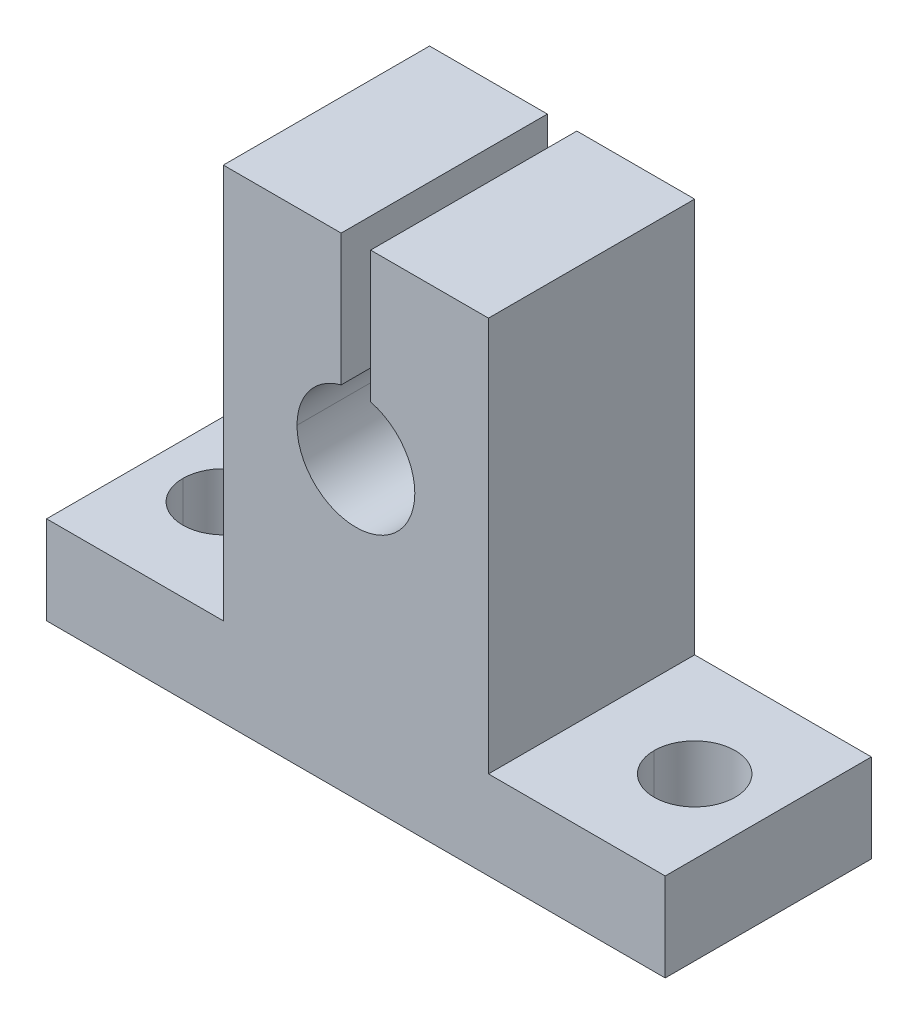
ISO-10303-21;
HEADER;
FILE_DESCRIPTION(('STEP AP214'),'2;1');
FILE_NAME('part.step','',(''),(''),'','','');
FILE_SCHEMA(('AUTOMOTIVE_DESIGN { 1 0 10303 214 1 1 1 1 }'));
ENDSEC;
DATA;
#1=APPLICATION_CONTEXT('core data for automotive mechanical design processes');
#2=APPLICATION_PROTOCOL_DEFINITION('international standard','automotive_design',2000,#1);
#3=PRODUCT_CONTEXT('',#1,'mechanical');
#4=PRODUCT('Part','Part','',(#3));
#5=PRODUCT_RELATED_PRODUCT_CATEGORY('part','',(#4));
#6=PRODUCT_DEFINITION_FORMATION('','',#4);
#7=PRODUCT_DEFINITION_CONTEXT('part definition',#1,'design');
#8=PRODUCT_DEFINITION('design','',#6,#7);
#9=PRODUCT_DEFINITION_SHAPE('','',#8);
#10=(LENGTH_UNIT() NAMED_UNIT(*) SI_UNIT(.MILLI.,.METRE.));
#11=(NAMED_UNIT(*) PLANE_ANGLE_UNIT() SI_UNIT($,.RADIAN.));
#12=(NAMED_UNIT(*) SI_UNIT($,.STERADIAN.) SOLID_ANGLE_UNIT());
#13=UNCERTAINTY_MEASURE_WITH_UNIT(LENGTH_MEASURE(1.E-05),#10,'distance_accuracy_value','');
#14=(GEOMETRIC_REPRESENTATION_CONTEXT(3) GLOBAL_UNCERTAINTY_ASSIGNED_CONTEXT((#13)) GLOBAL_UNIT_ASSIGNED_CONTEXT((#10,
#11,#12)) REPRESENTATION_CONTEXT('',''));
#15=CARTESIAN_POINT('',(0.,0.,0.));
#16=DIRECTION('',(0.,0.,1.));
#17=DIRECTION('',(1.,0.,0.));
#18=AXIS2_PLACEMENT_3D('',#15,#16,#17);
#19=CARTESIAN_POINT('',(16.,12.801,0.));
#20=DIRECTION('',(0.,-1.,0.));
#21=DIRECTION('',(1.,0.,0.));
#22=AXIS2_PLACEMENT_3D('',#19,#20,#21);
#23=CYLINDRICAL_SURFACE('',#22,2.75);
#24=DIRECTION('',(0.,-1.,0.));
#25=VECTOR('',#24,1.);
#26=CARTESIAN_POINT('',(13.25,12.801,0.));
#27=LINE('',#26,#25);
#28=CARTESIAN_POINT('',(13.25,-14.,0.));
#29=VERTEX_POINT('',#28);
#30=CARTESIAN_POINT('',(13.25,-20.,0.));
#31=VERTEX_POINT('',#30);
#32=EDGE_CURVE('E346',#29,#31,#27,.T.);
#33=ORIENTED_EDGE('',*,*,#32,.F.);
#34=CARTESIAN_POINT('',(16.,-14.,0.));
#35=DIRECTION('',(0.,-1.,0.));
#36=DIRECTION('',(1.,0.,0.));
#37=AXIS2_PLACEMENT_3D('',#34,#35,#36);
#38=CIRCLE('',#37,2.75);
#39=CARTESIAN_POINT('',(18.75,-14.,0.));
#40=VERTEX_POINT('',#39);
#41=EDGE_CURVE('E241',#40,#29,#38,.T.);
#42=ORIENTED_EDGE('',*,*,#41,.F.);
#43=DIRECTION('',(0.,-1.,0.));
#44=VECTOR('',#43,1.);
#45=CARTESIAN_POINT('',(18.75,12.801,0.));
#46=LINE('',#45,#44);
#47=CARTESIAN_POINT('',(18.75,-20.,0.));
#48=VERTEX_POINT('',#47);
#49=EDGE_CURVE('E353',#40,#48,#46,.T.);
#50=ORIENTED_EDGE('',*,*,#49,.T.);
#51=CARTESIAN_POINT('',(16.,-20.,0.));
#52=DIRECTION('',(0.,1.,0.));
#53=DIRECTION('',(-1.,0.,0.));
#54=AXIS2_PLACEMENT_3D('',#51,#52,#53);
#55=CIRCLE('',#54,2.75);
#56=EDGE_CURVE('E257',#31,#48,#55,.T.);
#57=ORIENTED_EDGE('',*,*,#56,.F.);
#58=EDGE_LOOP('',(#33,#42,#50,#57));
#59=FACE_BOUND('',#58,.T.);
#60=ADVANCED_FACE('F16',(#59),#23,.F.);
#61=CARTESIAN_POINT('',(-16.,12.801,0.));
#62=DIRECTION('',(0.,-1.,0.));
#63=DIRECTION('',(1.,0.,0.));
#64=AXIS2_PLACEMENT_3D('',#61,#62,#63);
#65=CYLINDRICAL_SURFACE('',#64,2.75);
#66=DIRECTION('',(0.,-1.,0.));
#67=VECTOR('',#66,1.);
#68=CARTESIAN_POINT('',(-18.75,12.801,0.));
#69=LINE('',#68,#67);
#70=CARTESIAN_POINT('',(-18.75,-14.,0.));
#71=VERTEX_POINT('',#70);
#72=CARTESIAN_POINT('',(-18.75,-20.,0.));
#73=VERTEX_POINT('',#72);
#74=EDGE_CURVE('E371',#71,#73,#69,.T.);
#75=ORIENTED_EDGE('',*,*,#74,.F.);
#76=CARTESIAN_POINT('',(-16.,-14.,0.));
#77=DIRECTION('',(0.,-1.,0.));
#78=DIRECTION('',(0.,0.,1.));
#79=AXIS2_PLACEMENT_3D('',#76,#77,#78);
#80=CIRCLE('',#79,2.75);
#81=CARTESIAN_POINT('',(-13.25,-14.,0.));
#82=VERTEX_POINT('',#81);
#83=EDGE_CURVE('E316',#82,#71,#80,.T.);
#84=ORIENTED_EDGE('',*,*,#83,.F.);
#85=DIRECTION('',(0.,-1.,0.));
#86=VECTOR('',#85,1.);
#87=CARTESIAN_POINT('',(-13.25,12.801,0.));
#88=LINE('',#87,#86);
#89=CARTESIAN_POINT('',(-13.25,-20.,0.));
#90=VERTEX_POINT('',#89);
#91=EDGE_CURVE('E357',#82,#90,#88,.T.);
#92=ORIENTED_EDGE('',*,*,#91,.T.);
#93=CARTESIAN_POINT('',(-16.,-20.,0.));
#94=DIRECTION('',(0.,-1.,0.));
#95=DIRECTION('',(1.,0.,0.));
#96=AXIS2_PLACEMENT_3D('',#93,#94,#95);
#97=CIRCLE('',#96,2.75);
#98=EDGE_CURVE('E260',#90,#73,#97,.T.);
#99=ORIENTED_EDGE('',*,*,#98,.T.);
#100=EDGE_LOOP('',(#75,#84,#92,#99));
#101=FACE_BOUND('',#100,.T.);
#102=ADVANCED_FACE('F443',(#101),#65,.F.);
#103=CARTESIAN_POINT('',(-1.40519726657091,-58.7537172992127,7.));
#104=DIRECTION('',(0.,0.,1.));
#105=DIRECTION('',(1.,0.,0.));
#106=AXIS2_PLACEMENT_3D('',#103,#104,#105);
#107=PLANE('',#106);
#108=CARTESIAN_POINT('',(0.,0.,7.));
#109=DIRECTION('',(0.,0.,1.));
#110=DIRECTION('',(1.,0.,0.));
#111=AXIS2_PLACEMENT_3D('',#108,#109,#110);
#112=CIRCLE('',#111,4.);
#113=CARTESIAN_POINT('',(-1.,3.87298334620742,7.));
#114=VERTEX_POINT('',#113);
#115=CARTESIAN_POINT('',(-4.,0.,7.));
#116=VERTEX_POINT('',#115);
#117=EDGE_CURVE('E194',#114,#116,#112,.T.);
#118=ORIENTED_EDGE('',*,*,#117,.F.);
#119=DIRECTION('',(0.,1.,0.));
#120=VECTOR('',#119,1.);
#121=CARTESIAN_POINT('',(-1.,-58.7537172992127,7.));
#122=LINE('',#121,#120);
#123=CARTESIAN_POINT('',(-1.,12.8,7.));
#124=VERTEX_POINT('',#123);
#125=EDGE_CURVE('E24',#114,#124,#122,.T.);
#126=ORIENTED_EDGE('',*,*,#125,.T.);
#127=DIRECTION('',(1.,0.,0.));
#128=VECTOR('',#127,1.);
#129=CARTESIAN_POINT('',(-1.40519726657091,12.8,7.));
#130=LINE('',#129,#128);
#131=CARTESIAN_POINT('',(-9.,12.8,7.));
#132=VERTEX_POINT('',#131);
#133=EDGE_CURVE('E330',#132,#124,#130,.T.);
#134=ORIENTED_EDGE('',*,*,#133,.F.);
#135=DIRECTION('',(0.,-1.,0.));
#136=VECTOR('',#135,1.);
#137=CARTESIAN_POINT('',(-9.,-58.7537172992127,7.));
#138=LINE('',#137,#136);
#139=CARTESIAN_POINT('',(-9.,-14.,7.));
#140=VERTEX_POINT('',#139);
#141=EDGE_CURVE('E317',#132,#140,#138,.T.);
#142=ORIENTED_EDGE('',*,*,#141,.T.);
#143=DIRECTION('',(-1.,0.,0.));
#144=VECTOR('',#143,1.);
#145=CARTESIAN_POINT('',(-1.40519726657091,-14.,7.));
#146=LINE('',#145,#144);
#147=CARTESIAN_POINT('',(-21.,-14.,7.));
#148=VERTEX_POINT('',#147);
#149=EDGE_CURVE('E308',#140,#148,#146,.T.);
#150=ORIENTED_EDGE('',*,*,#149,.T.);
#151=DIRECTION('',(0.,-1.,0.));
#152=VECTOR('',#151,1.);
#153=CARTESIAN_POINT('',(-21.,-58.7537172992127,7.));
#154=LINE('',#153,#152);
#155=CARTESIAN_POINT('',(-21.,-20.,7.));
#156=VERTEX_POINT('',#155);
#157=EDGE_CURVE('E223',#148,#156,#154,.T.);
#158=ORIENTED_EDGE('',*,*,#157,.T.);
#159=DIRECTION('',(1.,0.,0.));
#160=VECTOR('',#159,1.);
#161=CARTESIAN_POINT('',(-1.40519726657091,-20.,7.));
#162=LINE('',#161,#160);
#163=CARTESIAN_POINT('',(21.,-20.,7.));
#164=VERTEX_POINT('',#163);
#165=EDGE_CURVE('E243',#156,#164,#162,.T.);
#166=ORIENTED_EDGE('',*,*,#165,.T.);
#167=DIRECTION('',(0.,-1.,0.));
#168=VECTOR('',#167,1.);
#169=CARTESIAN_POINT('',(21.,-58.7537172992127,7.));
#170=LINE('',#169,#168);
#171=CARTESIAN_POINT('',(21.,-14.,7.));
#172=VERTEX_POINT('',#171);
#173=EDGE_CURVE('E294',#172,#164,#170,.T.);
#174=ORIENTED_EDGE('',*,*,#173,.F.);
#175=DIRECTION('',(1.,0.,0.));
#176=VECTOR('',#175,1.);
#177=CARTESIAN_POINT('',(-1.40519726657092,-14.,7.));
#178=LINE('',#177,#176);
#179=CARTESIAN_POINT('',(9.,-14.,7.));
#180=VERTEX_POINT('',#179);
#181=EDGE_CURVE('E202',#180,#172,#178,.T.);
#182=ORIENTED_EDGE('',*,*,#181,.F.);
#183=DIRECTION('',(0.,-1.,0.));
#184=VECTOR('',#183,1.);
#185=CARTESIAN_POINT('',(9.,-58.7537172992127,7.));
#186=LINE('',#185,#184);
#187=CARTESIAN_POINT('',(9.,12.8,7.));
#188=VERTEX_POINT('',#187);
#189=EDGE_CURVE('E286',#188,#180,#186,.T.);
#190=ORIENTED_EDGE('',*,*,#189,.F.);
#191=DIRECTION('',(1.,0.,0.));
#192=VECTOR('',#191,1.);
#193=CARTESIAN_POINT('',(-1.40519726657091,12.8,7.));
#194=LINE('',#193,#192);
#195=CARTESIAN_POINT('',(1.,12.8,7.));
#196=VERTEX_POINT('',#195);
#197=EDGE_CURVE('E188',#196,#188,#194,.T.);
#198=ORIENTED_EDGE('',*,*,#197,.F.);
#199=DIRECTION('',(0.,1.,0.));
#200=VECTOR('',#199,1.);
#201=CARTESIAN_POINT('',(1.00000000000001,-58.7537172992127,7.));
#202=LINE('',#201,#200);
#203=CARTESIAN_POINT('',(1.,3.87298334620742,7.));
#204=VERTEX_POINT('',#203);
#205=EDGE_CURVE('E185',#204,#196,#202,.T.);
#206=ORIENTED_EDGE('',*,*,#205,.F.);
#207=CARTESIAN_POINT('',(0.,0.,7.));
#208=DIRECTION('',(0.,0.,1.));
#209=DIRECTION('',(1.,0.,0.));
#210=AXIS2_PLACEMENT_3D('',#207,#208,#209);
#211=CIRCLE('',#210,4.);
#212=CARTESIAN_POINT('',(4.,0.,7.));
#213=VERTEX_POINT('',#212);
#214=EDGE_CURVE('E186',#213,#204,#211,.T.);
#215=ORIENTED_EDGE('',*,*,#214,.F.);
#216=CARTESIAN_POINT('',(0.,0.,7.));
#217=DIRECTION('',(0.,0.,1.));
#218=DIRECTION('',(1.,0.,0.));
#219=AXIS2_PLACEMENT_3D('',#216,#217,#218);
#220=CIRCLE('',#219,4.);
#221=EDGE_CURVE('E383',#116,#213,#220,.T.);
#222=ORIENTED_EDGE('',*,*,#221,.F.);
#223=EDGE_LOOP('',(#118,#126,#134,#142,#150,#158,#166,#174,#182,#190,#198,#206,#215,#222));
#224=FACE_BOUND('',#223,.T.);
#225=ADVANCED_FACE('F183',(#224),#107,.T.);
#226=CARTESIAN_POINT('',(-1.40519726657091,-58.7537172992127,-7.));
#227=DIRECTION('',(0.,0.,1.));
#228=DIRECTION('',(1.,0.,0.));
#229=AXIS2_PLACEMENT_3D('',#226,#227,#228);
#230=PLANE('',#229);
#231=CARTESIAN_POINT('',(0.,0.,-7.));
#232=DIRECTION('',(0.,0.,1.));
#233=DIRECTION('',(1.,0.,0.));
#234=AXIS2_PLACEMENT_3D('',#231,#232,#233);
#235=CIRCLE('',#234,4.);
#236=CARTESIAN_POINT('',(-1.,3.87298334620742,-7.));
#237=VERTEX_POINT('',#236);
#238=CARTESIAN_POINT('',(-4.,0.,-7.));
#239=VERTEX_POINT('',#238);
#240=EDGE_CURVE('E263',#237,#239,#235,.T.);
#241=ORIENTED_EDGE('',*,*,#240,.T.);
#242=CARTESIAN_POINT('',(0.,0.,-7.));
#243=DIRECTION('',(0.,0.,1.));
#244=DIRECTION('',(1.,0.,0.));
#245=AXIS2_PLACEMENT_3D('',#242,#243,#244);
#246=CIRCLE('',#245,4.);
#247=CARTESIAN_POINT('',(4.,0.,-7.));
#248=VERTEX_POINT('',#247);
#249=EDGE_CURVE('E361',#239,#248,#246,.T.);
#250=ORIENTED_EDGE('',*,*,#249,.T.);
#251=CARTESIAN_POINT('',(0.,0.,-7.));
#252=DIRECTION('',(0.,0.,1.));
#253=DIRECTION('',(1.,0.,0.));
#254=AXIS2_PLACEMENT_3D('',#251,#252,#253);
#255=CIRCLE('',#254,4.);
#256=CARTESIAN_POINT('',(1.,3.87298334620742,-7.));
#257=VERTEX_POINT('',#256);
#258=EDGE_CURVE('E215',#248,#257,#255,.T.);
#259=ORIENTED_EDGE('',*,*,#258,.T.);
#260=DIRECTION('',(0.,1.,0.));
#261=VECTOR('',#260,1.);
#262=CARTESIAN_POINT('',(1.00000000000001,-58.7537172992127,-7.));
#263=LINE('',#262,#261);
#264=CARTESIAN_POINT('',(1.,12.8,-7.));
#265=VERTEX_POINT('',#264);
#266=EDGE_CURVE('E203',#257,#265,#263,.T.);
#267=ORIENTED_EDGE('',*,*,#266,.T.);
#268=DIRECTION('',(1.,0.,0.));
#269=VECTOR('',#268,1.);
#270=CARTESIAN_POINT('',(-1.40519726657091,12.8,-7.));
#271=LINE('',#270,#269);
#272=CARTESIAN_POINT('',(9.,12.8,-7.));
#273=VERTEX_POINT('',#272);
#274=EDGE_CURVE('E282',#265,#273,#271,.T.);
#275=ORIENTED_EDGE('',*,*,#274,.T.);
#276=DIRECTION('',(0.,-1.,0.));
#277=VECTOR('',#276,1.);
#278=CARTESIAN_POINT('',(9.,-58.7537172992127,-7.));
#279=LINE('',#278,#277);
#280=CARTESIAN_POINT('',(9.,-14.,-7.));
#281=VERTEX_POINT('',#280);
#282=EDGE_CURVE('E291',#273,#281,#279,.T.);
#283=ORIENTED_EDGE('',*,*,#282,.T.);
#284=DIRECTION('',(1.,0.,0.));
#285=VECTOR('',#284,1.);
#286=CARTESIAN_POINT('',(-1.40519726657092,-14.,-7.));
#287=LINE('',#286,#285);
#288=CARTESIAN_POINT('',(21.,-14.,-7.));
#289=VERTEX_POINT('',#288);
#290=EDGE_CURVE('E234',#281,#289,#287,.T.);
#291=ORIENTED_EDGE('',*,*,#290,.T.);
#292=DIRECTION('',(0.,-1.,0.));
#293=VECTOR('',#292,1.);
#294=CARTESIAN_POINT('',(21.,-58.7537172992127,-7.));
#295=LINE('',#294,#293);
#296=CARTESIAN_POINT('',(21.,-20.,-7.));
#297=VERTEX_POINT('',#296);
#298=EDGE_CURVE('E228',#289,#297,#295,.T.);
#299=ORIENTED_EDGE('',*,*,#298,.T.);
#300=DIRECTION('',(1.,0.,0.));
#301=VECTOR('',#300,1.);
#302=CARTESIAN_POINT('',(-1.40519726657091,-20.,-7.));
#303=LINE('',#302,#301);
#304=CARTESIAN_POINT('',(-21.,-20.,-7.));
#305=VERTEX_POINT('',#304);
#306=EDGE_CURVE('E252',#305,#297,#303,.T.);
#307=ORIENTED_EDGE('',*,*,#306,.F.);
#308=DIRECTION('',(0.,-1.,0.));
#309=VECTOR('',#308,1.);
#310=CARTESIAN_POINT('',(-21.,-58.7537172992127,-7.));
#311=LINE('',#310,#309);
#312=CARTESIAN_POINT('',(-21.,-14.,-7.));
#313=VERTEX_POINT('',#312);
#314=EDGE_CURVE('E303',#313,#305,#311,.T.);
#315=ORIENTED_EDGE('',*,*,#314,.F.);
#316=DIRECTION('',(-1.,0.,0.));
#317=VECTOR('',#316,1.);
#318=CARTESIAN_POINT('',(-1.40519726657091,-14.,-7.));
#319=LINE('',#318,#317);
#320=CARTESIAN_POINT('',(-9.,-14.,-7.));
#321=VERTEX_POINT('',#320);
#322=EDGE_CURVE('E311',#321,#313,#319,.T.);
#323=ORIENTED_EDGE('',*,*,#322,.F.);
#324=DIRECTION('',(0.,-1.,0.));
#325=VECTOR('',#324,1.);
#326=CARTESIAN_POINT('',(-9.,-58.7537172992127,-7.));
#327=LINE('',#326,#325);
#328=CARTESIAN_POINT('',(-9.,12.8,-7.));
#329=VERTEX_POINT('',#328);
#330=EDGE_CURVE('E322',#329,#321,#327,.T.);
#331=ORIENTED_EDGE('',*,*,#330,.F.);
#332=DIRECTION('',(1.,0.,0.));
#333=VECTOR('',#332,1.);
#334=CARTESIAN_POINT('',(-1.40519726657091,12.8,-7.));
#335=LINE('',#334,#333);
#336=CARTESIAN_POINT('',(-1.,12.8,-7.));
#337=VERTEX_POINT('',#336);
#338=EDGE_CURVE('E285',#329,#337,#335,.T.);
#339=ORIENTED_EDGE('',*,*,#338,.T.);
#340=DIRECTION('',(0.,1.,0.));
#341=VECTOR('',#340,1.);
#342=CARTESIAN_POINT('',(-1.,-58.7537172992127,-7.));
#343=LINE('',#342,#341);
#344=EDGE_CURVE('E10',#237,#337,#343,.T.);
#345=ORIENTED_EDGE('',*,*,#344,.F.);
#346=EDGE_LOOP('',(#241,#250,#259,#267,#275,#283,#291,#299,#307,#315,#323,#331,#339,#345));
#347=FACE_BOUND('',#346,.T.);
#348=ADVANCED_FACE('F429',(#347),#230,.F.);
#349=CARTESIAN_POINT('',(-1.,-58.7537172992127,-7.));
#350=DIRECTION('',(1.,0.,0.));
#351=DIRECTION('',(0.,1.,0.));
#352=AXIS2_PLACEMENT_3D('',#349,#350,#351);
#353=PLANE('',#352);
#354=ORIENTED_EDGE('',*,*,#125,.F.);
#355=DIRECTION('',(0.,0.,1.));
#356=VECTOR('',#355,1.);
#357=CARTESIAN_POINT('',(-1.,3.87298334620742,-7.));
#358=LINE('',#357,#356);
#359=EDGE_CURVE('E266',#237,#114,#358,.T.);
#360=ORIENTED_EDGE('',*,*,#359,.F.);
#361=ORIENTED_EDGE('',*,*,#344,.T.);
#362=DIRECTION('',(0.,0.,1.));
#363=VECTOR('',#362,1.);
#364=CARTESIAN_POINT('',(-1.,12.8,-7.));
#365=LINE('',#364,#363);
#366=EDGE_CURVE('E329',#337,#124,#365,.T.);
#367=ORIENTED_EDGE('',*,*,#366,.T.);
#368=EDGE_LOOP('',(#354,#360,#361,#367));
#369=FACE_BOUND('',#368,.T.);
#370=ADVANCED_FACE('F716',(#369),#353,.T.);
#371=CARTESIAN_POINT('',(-1.40519726657091,12.8,-7.));
#372=DIRECTION('',(0.,-1.,0.));
#373=DIRECTION('',(0.,0.,-1.));
#374=AXIS2_PLACEMENT_3D('',#371,#372,#373);
#375=PLANE('',#374);
#376=ORIENTED_EDGE('',*,*,#133,.T.);
#377=ORIENTED_EDGE('',*,*,#366,.F.);
#378=ORIENTED_EDGE('',*,*,#338,.F.);
#379=DIRECTION('',(0.,0.,1.));
#380=VECTOR('',#379,1.);
#381=CARTESIAN_POINT('',(-9.,12.8,-7.));
#382=LINE('',#381,#380);
#383=EDGE_CURVE('E319',#329,#132,#382,.T.);
#384=ORIENTED_EDGE('',*,*,#383,.T.);
#385=EDGE_LOOP('',(#376,#377,#378,#384));
#386=FACE_BOUND('',#385,.T.);
#387=ADVANCED_FACE('F702',(#386),#375,.F.);
#388=CARTESIAN_POINT('',(-9.,-58.7537172992127,-7.));
#389=DIRECTION('',(-1.,0.,0.));
#390=DIRECTION('',(0.,1.,0.));
#391=AXIS2_PLACEMENT_3D('',#388,#389,#390);
#392=PLANE('',#391);
#393=ORIENTED_EDGE('',*,*,#141,.F.);
#394=ORIENTED_EDGE('',*,*,#383,.F.);
#395=ORIENTED_EDGE('',*,*,#330,.T.);
#396=DIRECTION('',(0.,0.,1.));
#397=VECTOR('',#396,1.);
#398=CARTESIAN_POINT('',(-9.,-14.,-7.));
#399=LINE('',#398,#397);
#400=EDGE_CURVE('E310',#321,#140,#399,.T.);
#401=ORIENTED_EDGE('',*,*,#400,.T.);
#402=EDGE_LOOP('',(#393,#394,#395,#401));
#403=FACE_BOUND('',#402,.T.);
#404=ADVANCED_FACE('F401',(#403),#392,.T.);
#405=CARTESIAN_POINT('',(-1.40519726657091,-14.,-7.));
#406=DIRECTION('',(0.,1.,0.));
#407=DIRECTION('',(1.,0.,0.));
#408=AXIS2_PLACEMENT_3D('',#405,#406,#407);
#409=PLANE('',#408);
#410=ORIENTED_EDGE('',*,*,#83,.T.);
#411=CARTESIAN_POINT('',(-16.,-14.,0.));
#412=DIRECTION('',(0.,-1.,0.));
#413=DIRECTION('',(0.,0.,1.));
#414=AXIS2_PLACEMENT_3D('',#411,#412,#413);
#415=CIRCLE('',#414,2.75);
#416=EDGE_CURVE('E358',#71,#82,#415,.T.);
#417=ORIENTED_EDGE('',*,*,#416,.T.);
#418=EDGE_LOOP('',(#410,#417));
#419=FACE_BOUND('',#418,.T.);
#420=ORIENTED_EDGE('',*,*,#149,.F.);
#421=ORIENTED_EDGE('',*,*,#400,.F.);
#422=ORIENTED_EDGE('',*,*,#322,.T.);
#423=DIRECTION('',(0.,0.,1.));
#424=VECTOR('',#423,1.);
#425=CARTESIAN_POINT('',(-21.,-14.,-7.));
#426=LINE('',#425,#424);
#427=EDGE_CURVE('E229',#313,#148,#426,.T.);
#428=ORIENTED_EDGE('',*,*,#427,.T.);
#429=EDGE_LOOP('',(#420,#421,#422,#428));
#430=FACE_BOUND('',#429,.T.);
#431=ADVANCED_FACE('F404',(#419,#430),#409,.T.);
#432=CARTESIAN_POINT('',(-21.,-58.7537172992127,-7.));
#433=DIRECTION('',(-1.,0.,0.));
#434=DIRECTION('',(0.,0.,1.));
#435=AXIS2_PLACEMENT_3D('',#432,#433,#434);
#436=PLANE('',#435);
#437=ORIENTED_EDGE('',*,*,#157,.F.);
#438=ORIENTED_EDGE('',*,*,#427,.F.);
#439=ORIENTED_EDGE('',*,*,#314,.T.);
#440=DIRECTION('',(0.,0.,1.));
#441=VECTOR('',#440,1.);
#442=CARTESIAN_POINT('',(-21.,-20.,-7.));
#443=LINE('',#442,#441);
#444=EDGE_CURVE('E248',#305,#156,#443,.T.);
#445=ORIENTED_EDGE('',*,*,#444,.T.);
#446=EDGE_LOOP('',(#437,#438,#439,#445));
#447=FACE_BOUND('',#446,.T.);
#448=ADVANCED_FACE('F409',(#447),#436,.T.);
#449=CARTESIAN_POINT('',(21.,-58.7537172992127,-7.));
#450=DIRECTION('',(-1.,0.,0.));
#451=DIRECTION('',(0.,1.,0.));
#452=AXIS2_PLACEMENT_3D('',#449,#450,#451);
#453=PLANE('',#452);
#454=ORIENTED_EDGE('',*,*,#173,.T.);
#455=DIRECTION('',(0.,0.,1.));
#456=VECTOR('',#455,1.);
#457=CARTESIAN_POINT('',(21.,-20.,-7.));
#458=LINE('',#457,#456);
#459=EDGE_CURVE('E258',#297,#164,#458,.T.);
#460=ORIENTED_EDGE('',*,*,#459,.F.);
#461=ORIENTED_EDGE('',*,*,#298,.F.);
#462=DIRECTION('',(0.,0.,1.));
#463=VECTOR('',#462,1.);
#464=CARTESIAN_POINT('',(21.,-14.,-7.));
#465=LINE('',#464,#463);
#466=EDGE_CURVE('E221',#289,#172,#465,.T.);
#467=ORIENTED_EDGE('',*,*,#466,.T.);
#468=EDGE_LOOP('',(#454,#460,#461,#467));
#469=FACE_BOUND('',#468,.T.);
#470=ADVANCED_FACE('F420',(#469),#453,.F.);
#471=CARTESIAN_POINT('',(9.,-58.7537172992127,-7.));
#472=DIRECTION('',(-1.,0.,0.));
#473=DIRECTION('',(0.,1.,0.));
#474=AXIS2_PLACEMENT_3D('',#471,#472,#473);
#475=PLANE('',#474);
#476=ORIENTED_EDGE('',*,*,#189,.T.);
#477=DIRECTION('',(0.,0.,1.));
#478=VECTOR('',#477,1.);
#479=CARTESIAN_POINT('',(9.,-14.,-7.));
#480=LINE('',#479,#478);
#481=EDGE_CURVE('E236',#281,#180,#480,.T.);
#482=ORIENTED_EDGE('',*,*,#481,.F.);
#483=ORIENTED_EDGE('',*,*,#282,.F.);
#484=DIRECTION('',(0.,0.,1.));
#485=VECTOR('',#484,1.);
#486=CARTESIAN_POINT('',(9.,12.8,-7.));
#487=LINE('',#486,#485);
#488=EDGE_CURVE('E279',#273,#188,#487,.T.);
#489=ORIENTED_EDGE('',*,*,#488,.T.);
#490=EDGE_LOOP('',(#476,#482,#483,#489));
#491=FACE_BOUND('',#490,.T.);
#492=ADVANCED_FACE('F430',(#491),#475,.F.);
#493=CARTESIAN_POINT('',(-1.40519726657091,12.8,-7.));
#494=DIRECTION('',(0.,-1.,0.));
#495=DIRECTION('',(0.,0.,-1.));
#496=AXIS2_PLACEMENT_3D('',#493,#494,#495);
#497=PLANE('',#496);
#498=ORIENTED_EDGE('',*,*,#197,.T.);
#499=ORIENTED_EDGE('',*,*,#488,.F.);
#500=ORIENTED_EDGE('',*,*,#274,.F.);
#501=DIRECTION('',(0.,0.,1.));
#502=VECTOR('',#501,1.);
#503=CARTESIAN_POINT('',(1.,12.8,-7.));
#504=LINE('',#503,#502);
#505=EDGE_CURVE('E192',#265,#196,#504,.T.);
#506=ORIENTED_EDGE('',*,*,#505,.T.);
#507=EDGE_LOOP('',(#498,#499,#500,#506));
#508=FACE_BOUND('',#507,.T.);
#509=ADVANCED_FACE('F427',(#508),#497,.F.);
#510=CARTESIAN_POINT('',(1.00000000000001,-58.7537172992127,-7.));
#511=DIRECTION('',(1.,0.,0.));
#512=DIRECTION('',(0.,1.,0.));
#513=AXIS2_PLACEMENT_3D('',#510,#511,#512);
#514=PLANE('',#513);
#515=ORIENTED_EDGE('',*,*,#205,.T.);
#516=ORIENTED_EDGE('',*,*,#505,.F.);
#517=ORIENTED_EDGE('',*,*,#266,.F.);
#518=DIRECTION('',(0.,0.,1.));
#519=VECTOR('',#518,1.);
#520=CARTESIAN_POINT('',(1.,3.87298334620742,-7.));
#521=LINE('',#520,#519);
#522=EDGE_CURVE('E196',#257,#204,#521,.T.);
#523=ORIENTED_EDGE('',*,*,#522,.T.);
#524=EDGE_LOOP('',(#515,#516,#517,#523));
#525=FACE_BOUND('',#524,.T.);
#526=ADVANCED_FACE('F200',(#525),#514,.F.);
#527=CARTESIAN_POINT('',(0.,0.,-7.));
#528=DIRECTION('',(0.,0.,1.));
#529=DIRECTION('',(1.,0.,0.));
#530=AXIS2_PLACEMENT_3D('',#527,#528,#529);
#531=CYLINDRICAL_SURFACE('',#530,4.);
#532=DIRECTION('',(0.,0.,1.));
#533=VECTOR('',#532,1.);
#534=CARTESIAN_POINT('',(-4.,0.,-7.));
#535=LINE('',#534,#533);
#536=EDGE_CURVE('E381',#239,#116,#535,.T.);
#537=ORIENTED_EDGE('',*,*,#536,.F.);
#538=ORIENTED_EDGE('',*,*,#240,.F.);
#539=ORIENTED_EDGE('',*,*,#359,.T.);
#540=ORIENTED_EDGE('',*,*,#117,.T.);
#541=EDGE_LOOP('',(#537,#538,#539,#540));
#542=FACE_BOUND('',#541,.T.);
#543=ADVANCED_FACE('F652',(#542),#531,.F.);
#544=CARTESIAN_POINT('',(-1.40519726657091,-20.,-7.));
#545=DIRECTION('',(0.,-1.,0.));
#546=DIRECTION('',(0.,0.,-1.));
#547=AXIS2_PLACEMENT_3D('',#544,#545,#546);
#548=PLANE('',#547);
#549=CARTESIAN_POINT('',(16.,-20.,0.));
#550=DIRECTION('',(0.,1.,0.));
#551=DIRECTION('',(-1.,0.,0.));
#552=AXIS2_PLACEMENT_3D('',#549,#550,#551);
#553=CIRCLE('',#552,2.75);
#554=EDGE_CURVE('E349',#48,#31,#553,.T.);
#555=ORIENTED_EDGE('',*,*,#554,.T.);
#556=ORIENTED_EDGE('',*,*,#56,.T.);
#557=EDGE_LOOP('',(#555,#556));
#558=FACE_BOUND('',#557,.T.);
#559=ORIENTED_EDGE('',*,*,#98,.F.);
#560=CARTESIAN_POINT('',(-16.,-20.,0.));
#561=DIRECTION('',(0.,-1.,0.));
#562=DIRECTION('',(1.,0.,0.));
#563=AXIS2_PLACEMENT_3D('',#560,#561,#562);
#564=CIRCLE('',#563,2.75);
#565=EDGE_CURVE('E365',#73,#90,#564,.T.);
#566=ORIENTED_EDGE('',*,*,#565,.F.);
#567=EDGE_LOOP('',(#559,#566));
#568=FACE_BOUND('',#567,.T.);
#569=ORIENTED_EDGE('',*,*,#165,.F.);
#570=ORIENTED_EDGE('',*,*,#444,.F.);
#571=ORIENTED_EDGE('',*,*,#306,.T.);
#572=ORIENTED_EDGE('',*,*,#459,.T.);
#573=EDGE_LOOP('',(#569,#570,#571,#572));
#574=FACE_BOUND('',#573,.T.);
#575=ADVANCED_FACE('F414',(#558,#568,#574),#548,.T.);
#576=CARTESIAN_POINT('',(-1.40519726657092,-14.,-7.));
#577=DIRECTION('',(0.,-1.,0.));
#578=DIRECTION('',(0.,0.,-1.));
#579=AXIS2_PLACEMENT_3D('',#576,#577,#578);
#580=PLANE('',#579);
#581=ORIENTED_EDGE('',*,*,#41,.T.);
#582=CARTESIAN_POINT('',(16.,-14.,0.));
#583=DIRECTION('',(0.,-1.,0.));
#584=DIRECTION('',(1.,0.,0.));
#585=AXIS2_PLACEMENT_3D('',#582,#583,#584);
#586=CIRCLE('',#585,2.75);
#587=EDGE_CURVE('E343',#29,#40,#586,.T.);
#588=ORIENTED_EDGE('',*,*,#587,.T.);
#589=EDGE_LOOP('',(#581,#588));
#590=FACE_BOUND('',#589,.T.);
#591=ORIENTED_EDGE('',*,*,#181,.T.);
#592=ORIENTED_EDGE('',*,*,#466,.F.);
#593=ORIENTED_EDGE('',*,*,#290,.F.);
#594=ORIENTED_EDGE('',*,*,#481,.T.);
#595=EDGE_LOOP('',(#591,#592,#593,#594));
#596=FACE_BOUND('',#595,.T.);
#597=ADVANCED_FACE('F421',(#590,#596),#580,.F.);
#598=CARTESIAN_POINT('',(0.,0.,-7.));
#599=DIRECTION('',(0.,0.,1.));
#600=DIRECTION('',(1.,0.,0.));
#601=AXIS2_PLACEMENT_3D('',#598,#599,#600);
#602=CYLINDRICAL_SURFACE('',#601,4.);
#603=ORIENTED_EDGE('',*,*,#258,.F.);
#604=DIRECTION('',(0.,0.,1.));
#605=VECTOR('',#604,1.);
#606=CARTESIAN_POINT('',(4.,0.,-7.));
#607=LINE('',#606,#605);
#608=EDGE_CURVE('E207',#248,#213,#607,.T.);
#609=ORIENTED_EDGE('',*,*,#608,.T.);
#610=ORIENTED_EDGE('',*,*,#214,.T.);
#611=ORIENTED_EDGE('',*,*,#522,.F.);
#612=EDGE_LOOP('',(#603,#609,#610,#611));
#613=FACE_BOUND('',#612,.T.);
#614=ADVANCED_FACE('F210',(#613),#602,.F.);
#615=CARTESIAN_POINT('',(0.,0.,-7.));
#616=DIRECTION('',(0.,0.,1.));
#617=DIRECTION('',(1.,0.,0.));
#618=AXIS2_PLACEMENT_3D('',#615,#616,#617);
#619=CYLINDRICAL_SURFACE('',#618,4.);
#620=ORIENTED_EDGE('',*,*,#249,.F.);
#621=ORIENTED_EDGE('',*,*,#536,.T.);
#622=ORIENTED_EDGE('',*,*,#221,.T.);
#623=ORIENTED_EDGE('',*,*,#608,.F.);
#624=EDGE_LOOP('',(#620,#621,#622,#623));
#625=FACE_BOUND('',#624,.T.);
#626=ADVANCED_FACE('F431',(#625),#619,.F.);
#627=CARTESIAN_POINT('',(-16.,12.801,0.));
#628=DIRECTION('',(0.,-1.,0.));
#629=DIRECTION('',(1.,0.,0.));
#630=AXIS2_PLACEMENT_3D('',#627,#628,#629);
#631=CYLINDRICAL_SURFACE('',#630,2.75);
#632=ORIENTED_EDGE('',*,*,#416,.F.);
#633=ORIENTED_EDGE('',*,*,#74,.T.);
#634=ORIENTED_EDGE('',*,*,#565,.T.);
#635=ORIENTED_EDGE('',*,*,#91,.F.);
#636=EDGE_LOOP('',(#632,#633,#634,#635));
#637=FACE_BOUND('',#636,.T.);
#638=ADVANCED_FACE('F433',(#637),#631,.F.);
#639=CARTESIAN_POINT('',(16.,12.801,0.));
#640=DIRECTION('',(0.,-1.,0.));
#641=DIRECTION('',(1.,0.,0.));
#642=AXIS2_PLACEMENT_3D('',#639,#640,#641);
#643=CYLINDRICAL_SURFACE('',#642,2.75);
#644=ORIENTED_EDGE('',*,*,#587,.F.);
#645=ORIENTED_EDGE('',*,*,#32,.T.);
#646=ORIENTED_EDGE('',*,*,#554,.F.);
#647=ORIENTED_EDGE('',*,*,#49,.F.);
#648=EDGE_LOOP('',(#644,#645,#646,#647));
#649=FACE_BOUND('',#648,.T.);
#650=ADVANCED_FACE('F439',(#649),#643,.F.);
#651=CLOSED_SHELL('',(#60,#102,#225,#348,#370,#387,#404,#431,#448,#470,#492,#509,#526,#543,#575,
#597,#614,#626,#638,#650));
#652=MANIFOLD_SOLID_BREP('B1',#651);
#653=ADVANCED_BREP_SHAPE_REPRESENTATION('',(#18,#652),#14);
#654=SHAPE_DEFINITION_REPRESENTATION(#9,#653);
ENDSEC;
END-ISO-10303-21;
